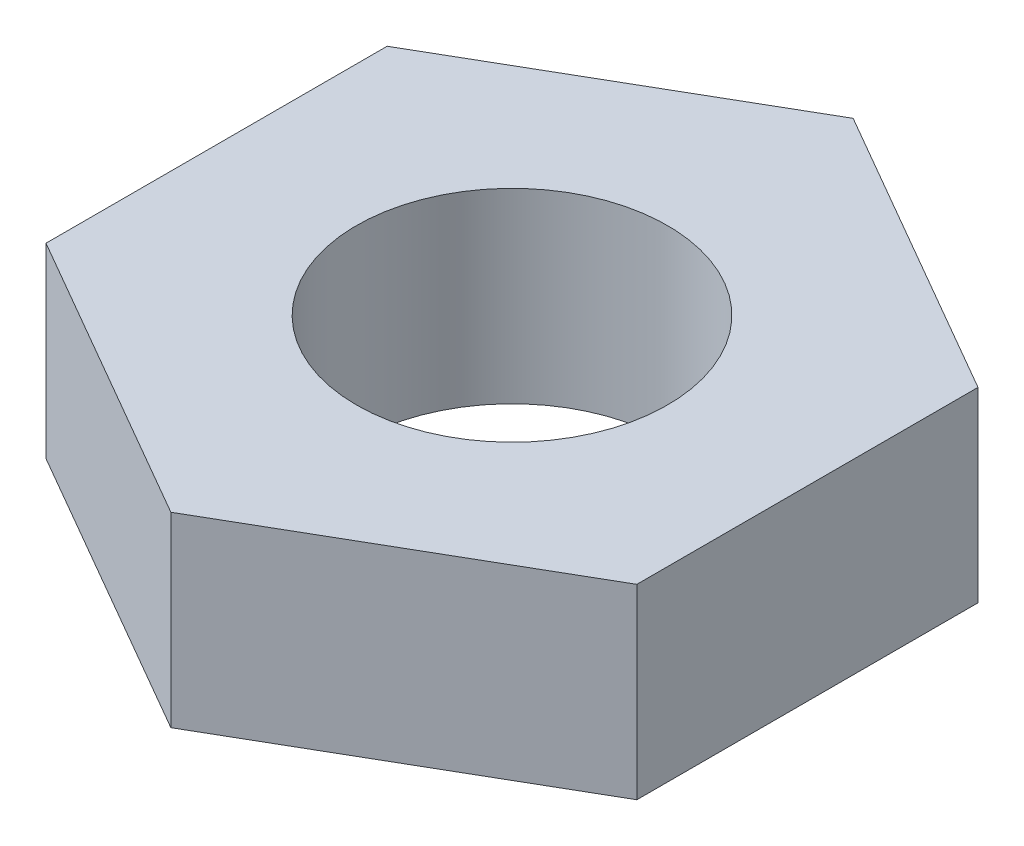
ISO-10303-21;
HEADER;
FILE_DESCRIPTION(('STEP AP214'),'2;1');
FILE_NAME('part.step','',(''),(''),'','','');
FILE_SCHEMA(('AUTOMOTIVE_DESIGN { 1 0 10303 214 1 1 1 1 }'));
ENDSEC;
DATA;
#1=APPLICATION_CONTEXT('core data for automotive mechanical design processes');
#2=APPLICATION_PROTOCOL_DEFINITION('international standard','automotive_design',2000,#1);
#3=PRODUCT_CONTEXT('',#1,'mechanical');
#4=PRODUCT('Part','Part','',(#3));
#5=PRODUCT_RELATED_PRODUCT_CATEGORY('part','',(#4));
#6=PRODUCT_DEFINITION_FORMATION('','',#4);
#7=PRODUCT_DEFINITION_CONTEXT('part definition',#1,'design');
#8=PRODUCT_DEFINITION('design','',#6,#7);
#9=PRODUCT_DEFINITION_SHAPE('','',#8);
#10=(LENGTH_UNIT() NAMED_UNIT(*) SI_UNIT(.MILLI.,.METRE.));
#11=(NAMED_UNIT(*) PLANE_ANGLE_UNIT() SI_UNIT($,.RADIAN.));
#12=(NAMED_UNIT(*) SI_UNIT($,.STERADIAN.) SOLID_ANGLE_UNIT());
#13=UNCERTAINTY_MEASURE_WITH_UNIT(LENGTH_MEASURE(1.E-05),#10,'distance_accuracy_value','');
#14=(GEOMETRIC_REPRESENTATION_CONTEXT(3) GLOBAL_UNCERTAINTY_ASSIGNED_CONTEXT((#13)) GLOBAL_UNIT_ASSIGNED_CONTEXT((#10,
#11,#12)) REPRESENTATION_CONTEXT('',''));
#15=CARTESIAN_POINT('',(0.,0.,0.));
#16=DIRECTION('',(0.,0.,1.));
#17=DIRECTION('',(1.,0.,0.));
#18=AXIS2_PLACEMENT_3D('',#15,#16,#17);
#19=CARTESIAN_POINT('',(0.,3.,0.));
#20=DIRECTION('',(0.,1.,0.));
#21=DIRECTION('',(0.,0.,1.));
#22=AXIS2_PLACEMENT_3D('',#19,#20,#21);
#23=PLANE('',#22);
#24=DIRECTION('',(-0.866025403784439,0.,-0.5));
#25=VECTOR('',#24,1.);
#26=CARTESIAN_POINT('',(4.75,3.,-2.74241377865072));
#27=LINE('',#26,#25);
#28=CARTESIAN_POINT('',(4.75,3.,-2.74241377865072));
#29=VERTEX_POINT('',#28);
#30=CARTESIAN_POINT('',(0.,3.,-5.48482755730144));
#31=VERTEX_POINT('',#30);
#32=EDGE_CURVE('E146',#29,#31,#27,.T.);
#33=ORIENTED_EDGE('',*,*,#32,.T.);
#34=DIRECTION('',(-0.866025403784438,0.,0.5));
#35=VECTOR('',#34,1.);
#36=CARTESIAN_POINT('',(0.,3.,-5.48482755730144));
#37=LINE('',#36,#35);
#38=CARTESIAN_POINT('',(-4.75,3.,-2.74241377865072));
#39=VERTEX_POINT('',#38);
#40=EDGE_CURVE('E94',#31,#39,#37,.T.);
#41=ORIENTED_EDGE('',*,*,#40,.T.);
#42=DIRECTION('',(0.,0.,1.));
#43=VECTOR('',#42,1.);
#44=CARTESIAN_POINT('',(-4.75,3.,-2.74241377865072));
#45=LINE('',#44,#43);
#46=CARTESIAN_POINT('',(-4.75,3.,2.74241377865072));
#47=VERTEX_POINT('',#46);
#48=EDGE_CURVE('E107',#39,#47,#45,.T.);
#49=ORIENTED_EDGE('',*,*,#48,.T.);
#50=DIRECTION('',(0.866025403784439,0.,0.5));
#51=VECTOR('',#50,1.);
#52=CARTESIAN_POINT('',(-4.75,3.,2.74241377865072));
#53=LINE('',#52,#51);
#54=CARTESIAN_POINT('',(0.,3.,5.48482755730144));
#55=VERTEX_POINT('',#54);
#56=EDGE_CURVE('E101',#47,#55,#53,.T.);
#57=ORIENTED_EDGE('',*,*,#56,.T.);
#58=DIRECTION('',(0.866025403784439,0.,-0.5));
#59=VECTOR('',#58,1.);
#60=CARTESIAN_POINT('',(0.,3.,5.48482755730144));
#61=LINE('',#60,#59);
#62=CARTESIAN_POINT('',(4.75,3.,2.74241377865072));
#63=VERTEX_POINT('',#62);
#64=EDGE_CURVE('E105',#55,#63,#61,.T.);
#65=ORIENTED_EDGE('',*,*,#64,.T.);
#66=DIRECTION('',(0.,0.,-1.));
#67=VECTOR('',#66,1.);
#68=CARTESIAN_POINT('',(4.75,3.,2.74241377865072));
#69=LINE('',#68,#67);
#70=EDGE_CURVE('E57',#63,#29,#69,.T.);
#71=ORIENTED_EDGE('',*,*,#70,.T.);
#72=EDGE_LOOP('',(#33,#41,#49,#57,#65,#71));
#73=FACE_BOUND('',#72,.T.);
#74=CARTESIAN_POINT('',(0.,3.,0.));
#75=DIRECTION('',(0.,1.,0.));
#76=DIRECTION('',(0.,0.,1.));
#77=AXIS2_PLACEMENT_3D('',#74,#75,#76);
#78=CIRCLE('',#77,2.5);
#79=CARTESIAN_POINT('',(0.,3.,2.5));
#80=VERTEX_POINT('',#79);
#81=EDGE_CURVE('E134',#80,#80,#78,.T.);
#82=ORIENTED_EDGE('',*,*,#81,.F.);
#83=EDGE_LOOP('',(#82));
#84=FACE_BOUND('',#83,.T.);
#85=ADVANCED_FACE('F39',(#73,#84),#23,.T.);
#86=CARTESIAN_POINT('',(0.,0.,0.));
#87=DIRECTION('',(0.,1.,0.));
#88=DIRECTION('',(0.,0.,1.));
#89=AXIS2_PLACEMENT_3D('',#86,#87,#88);
#90=PLANE('',#89);
#91=DIRECTION('',(-0.866025403784439,0.,-0.5));
#92=VECTOR('',#91,1.);
#93=CARTESIAN_POINT('',(4.75,0.,-2.74241377865072));
#94=LINE('',#93,#92);
#95=CARTESIAN_POINT('',(4.75,0.,-2.74241377865072));
#96=VERTEX_POINT('',#95);
#97=CARTESIAN_POINT('',(0.,0.,-5.48482755730144));
#98=VERTEX_POINT('',#97);
#99=EDGE_CURVE('E129',#96,#98,#94,.T.);
#100=ORIENTED_EDGE('',*,*,#99,.F.);
#101=DIRECTION('',(0.,0.,-1.));
#102=VECTOR('',#101,1.);
#103=CARTESIAN_POINT('',(4.75,0.,2.74241377865072));
#104=LINE('',#103,#102);
#105=CARTESIAN_POINT('',(4.75,0.,2.74241377865072));
#106=VERTEX_POINT('',#105);
#107=EDGE_CURVE('E86',#106,#96,#104,.T.);
#108=ORIENTED_EDGE('',*,*,#107,.F.);
#109=DIRECTION('',(0.866025403784439,0.,-0.5));
#110=VECTOR('',#109,1.);
#111=CARTESIAN_POINT('',(0.,0.,5.48482755730144));
#112=LINE('',#111,#110);
#113=CARTESIAN_POINT('',(0.,0.,5.48482755730144));
#114=VERTEX_POINT('',#113);
#115=EDGE_CURVE('E80',#114,#106,#112,.T.);
#116=ORIENTED_EDGE('',*,*,#115,.F.);
#117=DIRECTION('',(0.866025403784439,0.,0.5));
#118=VECTOR('',#117,1.);
#119=CARTESIAN_POINT('',(-4.75,0.,2.74241377865072));
#120=LINE('',#119,#118);
#121=CARTESIAN_POINT('',(-4.75,0.,2.74241377865072));
#122=VERTEX_POINT('',#121);
#123=EDGE_CURVE('E116',#122,#114,#120,.T.);
#124=ORIENTED_EDGE('',*,*,#123,.F.);
#125=DIRECTION('',(0.,0.,1.));
#126=VECTOR('',#125,1.);
#127=CARTESIAN_POINT('',(-4.75,0.,-2.74241377865072));
#128=LINE('',#127,#126);
#129=CARTESIAN_POINT('',(-4.75,0.,-2.74241377865072));
#130=VERTEX_POINT('',#129);
#131=EDGE_CURVE('E137',#130,#122,#128,.T.);
#132=ORIENTED_EDGE('',*,*,#131,.F.);
#133=DIRECTION('',(-0.866025403784438,0.,0.5));
#134=VECTOR('',#133,1.);
#135=CARTESIAN_POINT('',(0.,0.,-5.48482755730144));
#136=LINE('',#135,#134);
#137=EDGE_CURVE('E133',#98,#130,#136,.T.);
#138=ORIENTED_EDGE('',*,*,#137,.F.);
#139=EDGE_LOOP('',(#100,#108,#116,#124,#132,#138));
#140=FACE_BOUND('',#139,.T.);
#141=CARTESIAN_POINT('',(0.,0.,0.));
#142=DIRECTION('',(0.,1.,0.));
#143=DIRECTION('',(0.,0.,1.));
#144=AXIS2_PLACEMENT_3D('',#141,#142,#143);
#145=CIRCLE('',#144,2.5);
#146=CARTESIAN_POINT('',(0.,0.,2.5));
#147=VERTEX_POINT('',#146);
#148=EDGE_CURVE('E243',#147,#147,#145,.T.);
#149=ORIENTED_EDGE('',*,*,#148,.T.);
#150=EDGE_LOOP('',(#149));
#151=FACE_BOUND('',#150,.T.);
#152=ADVANCED_FACE('F159',(#140,#151),#90,.F.);
#153=CARTESIAN_POINT('',(4.75,3.,-2.74241377865072));
#154=DIRECTION('',(-0.5,0.,0.866025403784439));
#155=DIRECTION('',(0.866025403784439,0.,0.5));
#156=AXIS2_PLACEMENT_3D('',#153,#154,#155);
#157=PLANE('',#156);
#158=ORIENTED_EDGE('',*,*,#99,.T.);
#159=DIRECTION('',(0.,-1.,0.));
#160=VECTOR('',#159,1.);
#161=CARTESIAN_POINT('',(0.,3.,-5.48482755730144));
#162=LINE('',#161,#160);
#163=EDGE_CURVE('E11',#31,#98,#162,.T.);
#164=ORIENTED_EDGE('',*,*,#163,.F.);
#165=ORIENTED_EDGE('',*,*,#32,.F.);
#166=DIRECTION('',(0.,-1.,0.));
#167=VECTOR('',#166,1.);
#168=CARTESIAN_POINT('',(4.75,3.,-2.74241377865072));
#169=LINE('',#168,#167);
#170=EDGE_CURVE('E125',#29,#96,#169,.T.);
#171=ORIENTED_EDGE('',*,*,#170,.T.);
#172=EDGE_LOOP('',(#158,#164,#165,#171));
#173=FACE_BOUND('',#172,.T.);
#174=ADVANCED_FACE('F41',(#173),#157,.F.);
#175=CARTESIAN_POINT('',(0.,3.,-5.48482755730144));
#176=DIRECTION('',(0.5,0.,0.866025403784439));
#177=DIRECTION('',(0.866025403784439,0.,-0.5));
#178=AXIS2_PLACEMENT_3D('',#175,#176,#177);
#179=PLANE('',#178);
#180=ORIENTED_EDGE('',*,*,#137,.T.);
#181=DIRECTION('',(0.,-1.,0.));
#182=VECTOR('',#181,1.);
#183=CARTESIAN_POINT('',(-4.75,3.,-2.74241377865072));
#184=LINE('',#183,#182);
#185=EDGE_CURVE('E49',#39,#130,#184,.T.);
#186=ORIENTED_EDGE('',*,*,#185,.F.);
#187=ORIENTED_EDGE('',*,*,#40,.F.);
#188=ORIENTED_EDGE('',*,*,#163,.T.);
#189=EDGE_LOOP('',(#180,#186,#187,#188));
#190=FACE_BOUND('',#189,.T.);
#191=ADVANCED_FACE('F184',(#190),#179,.F.);
#192=CARTESIAN_POINT('',(-4.75,3.,-2.74241377865072));
#193=DIRECTION('',(1.,0.,0.));
#194=DIRECTION('',(0.,0.,-1.));
#195=AXIS2_PLACEMENT_3D('',#192,#193,#194);
#196=PLANE('',#195);
#197=ORIENTED_EDGE('',*,*,#131,.T.);
#198=DIRECTION('',(0.,-1.,0.));
#199=VECTOR('',#198,1.);
#200=CARTESIAN_POINT('',(-4.75,3.,2.74241377865072));
#201=LINE('',#200,#199);
#202=EDGE_CURVE('E118',#47,#122,#201,.T.);
#203=ORIENTED_EDGE('',*,*,#202,.F.);
#204=ORIENTED_EDGE('',*,*,#48,.F.);
#205=ORIENTED_EDGE('',*,*,#185,.T.);
#206=EDGE_LOOP('',(#197,#203,#204,#205));
#207=FACE_BOUND('',#206,.T.);
#208=ADVANCED_FACE('F156',(#207),#196,.F.);
#209=CARTESIAN_POINT('',(-4.75,3.,2.74241377865072));
#210=DIRECTION('',(0.5,0.,-0.866025403784439));
#211=DIRECTION('',(-0.866025403784439,0.,-0.5));
#212=AXIS2_PLACEMENT_3D('',#209,#210,#211);
#213=PLANE('',#212);
#214=ORIENTED_EDGE('',*,*,#123,.T.);
#215=DIRECTION('',(0.,-1.,0.));
#216=VECTOR('',#215,1.);
#217=CARTESIAN_POINT('',(0.,3.,5.48482755730144));
#218=LINE('',#217,#216);
#219=EDGE_CURVE('E113',#55,#114,#218,.T.);
#220=ORIENTED_EDGE('',*,*,#219,.F.);
#221=ORIENTED_EDGE('',*,*,#56,.F.);
#222=ORIENTED_EDGE('',*,*,#202,.T.);
#223=EDGE_LOOP('',(#214,#220,#221,#222));
#224=FACE_BOUND('',#223,.T.);
#225=ADVANCED_FACE('F114',(#224),#213,.F.);
#226=CARTESIAN_POINT('',(0.,3.,5.48482755730144));
#227=DIRECTION('',(-0.5,0.,-0.866025403784439));
#228=DIRECTION('',(-0.866025403784439,0.,0.5));
#229=AXIS2_PLACEMENT_3D('',#226,#227,#228);
#230=PLANE('',#229);
#231=ORIENTED_EDGE('',*,*,#115,.T.);
#232=DIRECTION('',(0.,-1.,0.));
#233=VECTOR('',#232,1.);
#234=CARTESIAN_POINT('',(4.75,3.,2.74241377865072));
#235=LINE('',#234,#233);
#236=EDGE_CURVE('E119',#63,#106,#235,.T.);
#237=ORIENTED_EDGE('',*,*,#236,.F.);
#238=ORIENTED_EDGE('',*,*,#64,.F.);
#239=ORIENTED_EDGE('',*,*,#219,.T.);
#240=EDGE_LOOP('',(#231,#237,#238,#239));
#241=FACE_BOUND('',#240,.T.);
#242=ADVANCED_FACE('F121',(#241),#230,.F.);
#243=CARTESIAN_POINT('',(4.75,3.,2.74241377865072));
#244=DIRECTION('',(-1.,0.,0.));
#245=DIRECTION('',(0.,0.,1.));
#246=AXIS2_PLACEMENT_3D('',#243,#244,#245);
#247=PLANE('',#246);
#248=ORIENTED_EDGE('',*,*,#107,.T.);
#249=ORIENTED_EDGE('',*,*,#170,.F.);
#250=ORIENTED_EDGE('',*,*,#70,.F.);
#251=ORIENTED_EDGE('',*,*,#236,.T.);
#252=EDGE_LOOP('',(#248,#249,#250,#251));
#253=FACE_BOUND('',#252,.T.);
#254=ADVANCED_FACE('F164',(#253),#247,.F.);
#255=CARTESIAN_POINT('',(0.,3.,0.));
#256=DIRECTION('',(0.,-1.,0.));
#257=DIRECTION('',(0.,0.,-1.));
#258=AXIS2_PLACEMENT_3D('',#255,#256,#257);
#259=CYLINDRICAL_SURFACE('',#258,2.5);
#260=ORIENTED_EDGE('',*,*,#81,.T.);
#261=EDGE_LOOP('',(#260));
#262=FACE_BOUND('',#261,.T.);
#263=ORIENTED_EDGE('',*,*,#148,.F.);
#264=EDGE_LOOP('',(#263));
#265=FACE_BOUND('',#264,.T.);
#266=ADVANCED_FACE('F166',(#262,#265),#259,.F.);
#267=CLOSED_SHELL('',(#85,#152,#174,#191,#208,#225,#242,#254,#266));
#268=MANIFOLD_SOLID_BREP('B2',#267);
#269=ADVANCED_BREP_SHAPE_REPRESENTATION('',(#18,#268),#14);
#270=SHAPE_DEFINITION_REPRESENTATION(#9,#269);
ENDSEC;
END-ISO-10303-21;
